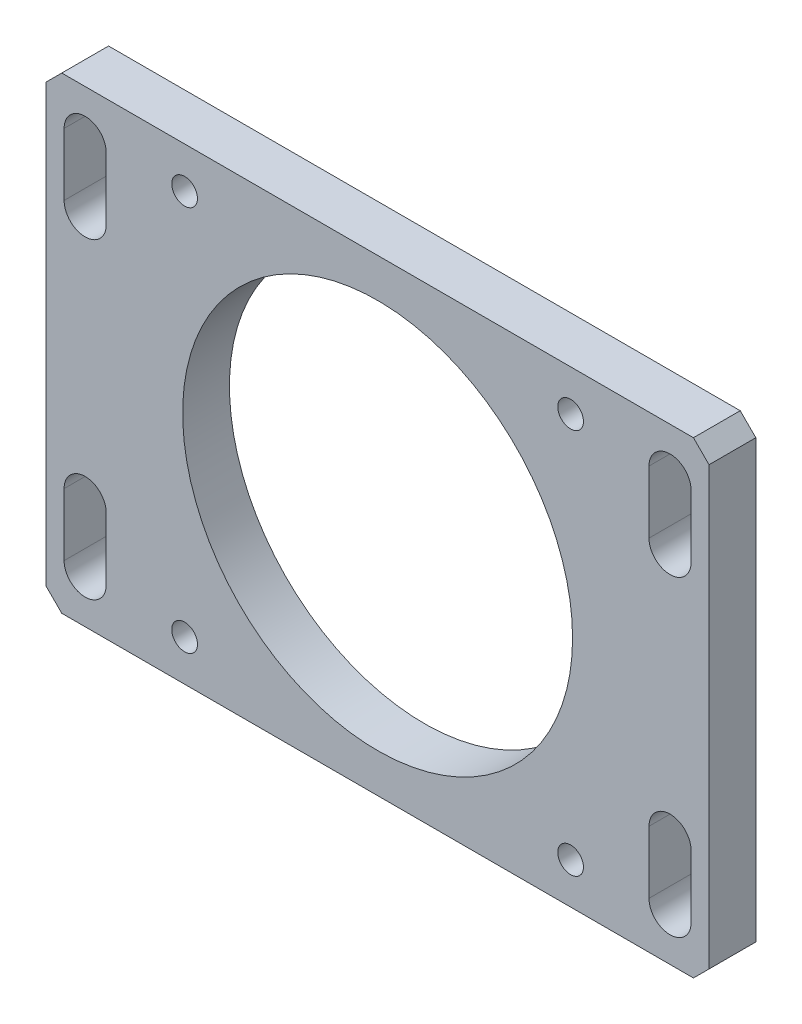
ISO-10303-21;
HEADER;
FILE_DESCRIPTION(('STEP AP214'),'2;1');
FILE_NAME('part.step','',(''),(''),'','','');
FILE_SCHEMA(('AUTOMOTIVE_DESIGN { 1 0 10303 214 1 1 1 1 }'));
ENDSEC;
DATA;
#1=APPLICATION_CONTEXT('core data for automotive mechanical design processes');
#2=APPLICATION_PROTOCOL_DEFINITION('international standard','automotive_design',2000,#1);
#3=PRODUCT_CONTEXT('',#1,'mechanical');
#4=PRODUCT('Part','Part','',(#3));
#5=PRODUCT_RELATED_PRODUCT_CATEGORY('part','',(#4));
#6=PRODUCT_DEFINITION_FORMATION('','',#4);
#7=PRODUCT_DEFINITION_CONTEXT('part definition',#1,'design');
#8=PRODUCT_DEFINITION('design','',#6,#7);
#9=PRODUCT_DEFINITION_SHAPE('','',#8);
#10=(LENGTH_UNIT() NAMED_UNIT(*) SI_UNIT(.MILLI.,.METRE.));
#11=(NAMED_UNIT(*) PLANE_ANGLE_UNIT() SI_UNIT($,.RADIAN.));
#12=(NAMED_UNIT(*) SI_UNIT($,.STERADIAN.) SOLID_ANGLE_UNIT());
#13=UNCERTAINTY_MEASURE_WITH_UNIT(LENGTH_MEASURE(1.E-05),#10,'distance_accuracy_value','');
#14=(GEOMETRIC_REPRESENTATION_CONTEXT(3) GLOBAL_UNCERTAINTY_ASSIGNED_CONTEXT((#13)) GLOBAL_UNIT_ASSIGNED_CONTEXT((#10,
#11,#12)) REPRESENTATION_CONTEXT('',''));
#15=CARTESIAN_POINT('',(0.,0.,0.));
#16=DIRECTION('',(0.,0.,1.));
#17=DIRECTION('',(1.,0.,0.));
#18=AXIS2_PLACEMENT_3D('',#15,#16,#17);
#19=CARTESIAN_POINT('',(0.,0.,6.));
#20=DIRECTION('',(0.,0.,-1.));
#21=DIRECTION('',(-1.,0.,0.));
#22=AXIS2_PLACEMENT_3D('',#19,#20,#21);
#23=PLANE('',#22);
#24=DIRECTION('',(0.,1.,0.));
#25=VECTOR('',#24,1.);
#26=CARTESIAN_POINT('',(-34.8,-24.,6.));
#27=LINE('',#26,#25);
#28=CARTESIAN_POINT('',(-34.8,-24.,6.));
#29=VERTEX_POINT('',#28);
#30=CARTESIAN_POINT('',(-34.8,-16.,6.));
#31=VERTEX_POINT('',#30);
#32=EDGE_CURVE('E233',#29,#31,#27,.T.);
#33=ORIENTED_EDGE('',*,*,#32,.F.);
#34=CARTESIAN_POINT('',(-37.5,-24.,6.));
#35=DIRECTION('',(0.,0.,1.));
#36=DIRECTION('',(1.,0.,0.));
#37=AXIS2_PLACEMENT_3D('',#34,#35,#36);
#38=CIRCLE('',#37,2.70000000000001);
#39=CARTESIAN_POINT('',(-40.2,-24.,6.));
#40=VERTEX_POINT('',#39);
#41=EDGE_CURVE('E206',#40,#29,#38,.T.);
#42=ORIENTED_EDGE('',*,*,#41,.F.);
#43=DIRECTION('',(0.,-1.,0.));
#44=VECTOR('',#43,1.);
#45=CARTESIAN_POINT('',(-40.2,-24.,6.));
#46=LINE('',#45,#44);
#47=CARTESIAN_POINT('',(-40.2,-16.,6.));
#48=VERTEX_POINT('',#47);
#49=EDGE_CURVE('E224',#48,#40,#46,.T.);
#50=ORIENTED_EDGE('',*,*,#49,.F.);
#51=CARTESIAN_POINT('',(-37.5,-16.,6.));
#52=DIRECTION('',(0.,0.,1.));
#53=DIRECTION('',(1.,0.,0.));
#54=AXIS2_PLACEMENT_3D('',#51,#52,#53);
#55=CIRCLE('',#54,2.70000000000001);
#56=EDGE_CURVE('E227',#31,#48,#55,.T.);
#57=ORIENTED_EDGE('',*,*,#56,.F.);
#58=EDGE_LOOP('',(#33,#42,#50,#57));
#59=FACE_BOUND('',#58,.T.);
#60=DIRECTION('',(0.,-1.,0.));
#61=VECTOR('',#60,1.);
#62=CARTESIAN_POINT('',(-40.2,24.,6.));
#63=LINE('',#62,#61);
#64=CARTESIAN_POINT('',(-40.2,24.,6.));
#65=VERTEX_POINT('',#64);
#66=CARTESIAN_POINT('',(-40.2,16.,6.));
#67=VERTEX_POINT('',#66);
#68=EDGE_CURVE('E258',#65,#67,#63,.T.);
#69=ORIENTED_EDGE('',*,*,#68,.F.);
#70=CARTESIAN_POINT('',(-37.5,24.,6.));
#71=DIRECTION('',(0.,0.,1.));
#72=DIRECTION('',(-1.,0.,0.));
#73=AXIS2_PLACEMENT_3D('',#70,#71,#72);
#74=CIRCLE('',#73,2.70000000000001);
#75=CARTESIAN_POINT('',(-34.8,24.,6.));
#76=VERTEX_POINT('',#75);
#77=EDGE_CURVE('E239',#76,#65,#74,.T.);
#78=ORIENTED_EDGE('',*,*,#77,.F.);
#79=DIRECTION('',(0.,1.,0.));
#80=VECTOR('',#79,1.);
#81=CARTESIAN_POINT('',(-34.8,24.,6.));
#82=LINE('',#81,#80);
#83=CARTESIAN_POINT('',(-34.8,16.,6.));
#84=VERTEX_POINT('',#83);
#85=EDGE_CURVE('E247',#84,#76,#82,.T.);
#86=ORIENTED_EDGE('',*,*,#85,.F.);
#87=CARTESIAN_POINT('',(-37.5,16.,6.));
#88=DIRECTION('',(0.,0.,1.));
#89=DIRECTION('',(-1.,0.,0.));
#90=AXIS2_PLACEMENT_3D('',#87,#88,#89);
#91=CIRCLE('',#90,2.70000000000001);
#92=EDGE_CURVE('E261',#67,#84,#91,.T.);
#93=ORIENTED_EDGE('',*,*,#92,.F.);
#94=EDGE_LOOP('',(#69,#78,#86,#93));
#95=FACE_BOUND('',#94,.T.);
#96=DIRECTION('',(0.,1.,0.));
#97=VECTOR('',#96,1.);
#98=CARTESIAN_POINT('',(40.2,-24.,6.));
#99=LINE('',#98,#97);
#100=CARTESIAN_POINT('',(40.2,-24.,6.));
#101=VERTEX_POINT('',#100);
#102=CARTESIAN_POINT('',(40.2,-16.,6.));
#103=VERTEX_POINT('',#102);
#104=EDGE_CURVE('E290',#101,#103,#99,.T.);
#105=ORIENTED_EDGE('',*,*,#104,.F.);
#106=CARTESIAN_POINT('',(37.5,-24.,6.));
#107=DIRECTION('',(0.,0.,1.));
#108=DIRECTION('',(-1.,0.,0.));
#109=AXIS2_PLACEMENT_3D('',#106,#107,#108);
#110=CIRCLE('',#109,2.70000000000001);
#111=CARTESIAN_POINT('',(34.8,-24.,6.));
#112=VERTEX_POINT('',#111);
#113=EDGE_CURVE('E268',#112,#101,#110,.T.);
#114=ORIENTED_EDGE('',*,*,#113,.F.);
#115=DIRECTION('',(0.,-1.,0.));
#116=VECTOR('',#115,1.);
#117=CARTESIAN_POINT('',(34.8,-24.,6.));
#118=LINE('',#117,#116);
#119=CARTESIAN_POINT('',(34.8,-16.,6.));
#120=VERTEX_POINT('',#119);
#121=EDGE_CURVE('E279',#120,#112,#118,.T.);
#122=ORIENTED_EDGE('',*,*,#121,.F.);
#123=CARTESIAN_POINT('',(37.5,-16.,6.));
#124=DIRECTION('',(0.,0.,1.));
#125=DIRECTION('',(-1.,0.,0.));
#126=AXIS2_PLACEMENT_3D('',#123,#124,#125);
#127=CIRCLE('',#126,2.70000000000001);
#128=EDGE_CURVE('E293',#103,#120,#127,.T.);
#129=ORIENTED_EDGE('',*,*,#128,.F.);
#130=EDGE_LOOP('',(#105,#114,#122,#129));
#131=FACE_BOUND('',#130,.T.);
#132=DIRECTION('',(0.,-1.,0.));
#133=VECTOR('',#132,1.);
#134=CARTESIAN_POINT('',(34.8,24.,6.));
#135=LINE('',#134,#133);
#136=CARTESIAN_POINT('',(34.8,24.,6.));
#137=VERTEX_POINT('',#136);
#138=CARTESIAN_POINT('',(34.8,16.,6.));
#139=VERTEX_POINT('',#138);
#140=EDGE_CURVE('E322',#137,#139,#135,.T.);
#141=ORIENTED_EDGE('',*,*,#140,.F.);
#142=CARTESIAN_POINT('',(37.5,24.,6.));
#143=DIRECTION('',(0.,0.,1.));
#144=DIRECTION('',(1.,0.,0.));
#145=AXIS2_PLACEMENT_3D('',#142,#143,#144);
#146=CIRCLE('',#145,2.70000000000001);
#147=CARTESIAN_POINT('',(40.2,24.,6.));
#148=VERTEX_POINT('',#147);
#149=EDGE_CURVE('E300',#148,#137,#146,.T.);
#150=ORIENTED_EDGE('',*,*,#149,.F.);
#151=DIRECTION('',(0.,1.,0.));
#152=VECTOR('',#151,1.);
#153=CARTESIAN_POINT('',(40.2,24.,6.));
#154=LINE('',#153,#152);
#155=CARTESIAN_POINT('',(40.2,16.,6.));
#156=VERTEX_POINT('',#155);
#157=EDGE_CURVE('E311',#156,#148,#154,.T.);
#158=ORIENTED_EDGE('',*,*,#157,.F.);
#159=CARTESIAN_POINT('',(37.5,16.,6.));
#160=DIRECTION('',(0.,0.,1.));
#161=DIRECTION('',(1.,0.,0.));
#162=AXIS2_PLACEMENT_3D('',#159,#160,#161);
#163=CIRCLE('',#162,2.70000000000001);
#164=EDGE_CURVE('E325',#139,#156,#163,.T.);
#165=ORIENTED_EDGE('',*,*,#164,.F.);
#166=EDGE_LOOP('',(#141,#150,#158,#165));
#167=FACE_BOUND('',#166,.T.);
#168=CARTESIAN_POINT('',(-24.7487373415288,24.7487373415296,6.));
#169=DIRECTION('',(0.,0.,1.));
#170=DIRECTION('',(1.,0.,0.));
#171=AXIS2_PLACEMENT_3D('',#168,#169,#170);
#172=CIRCLE('',#171,1.65);
#173=CARTESIAN_POINT('',(-23.0987373415288,24.7487373415296,6.));
#174=VERTEX_POINT('',#173);
#175=EDGE_CURVE('E332',#174,#174,#172,.T.);
#176=ORIENTED_EDGE('',*,*,#175,.F.);
#177=EDGE_LOOP('',(#176));
#178=FACE_BOUND('',#177,.T.);
#179=CARTESIAN_POINT('',(-24.7487373415293,-24.748737341529,6.));
#180=DIRECTION('',(0.,0.,1.));
#181=DIRECTION('',(1.,0.,0.));
#182=AXIS2_PLACEMENT_3D('',#179,#180,#181);
#183=CIRCLE('',#182,1.65);
#184=CARTESIAN_POINT('',(-23.0987373415293,-24.748737341529,6.));
#185=VERTEX_POINT('',#184);
#186=EDGE_CURVE('E342',#185,#185,#183,.T.);
#187=ORIENTED_EDGE('',*,*,#186,.F.);
#188=EDGE_LOOP('',(#187));
#189=FACE_BOUND('',#188,.T.);
#190=CARTESIAN_POINT('',(24.7487373415289,-24.7487373415294,6.));
#191=DIRECTION('',(0.,0.,1.));
#192=DIRECTION('',(1.,0.,0.));
#193=AXIS2_PLACEMENT_3D('',#190,#191,#192);
#194=CIRCLE('',#193,1.65);
#195=CARTESIAN_POINT('',(26.3987373415289,-24.7487373415294,6.));
#196=VERTEX_POINT('',#195);
#197=EDGE_CURVE('E346',#196,#196,#194,.T.);
#198=ORIENTED_EDGE('',*,*,#197,.F.);
#199=EDGE_LOOP('',(#198));
#200=FACE_BOUND('',#199,.T.);
#201=CARTESIAN_POINT('',(24.7487373415293,24.748737341529,6.));
#202=DIRECTION('',(0.,0.,1.));
#203=DIRECTION('',(1.,0.,0.));
#204=AXIS2_PLACEMENT_3D('',#201,#202,#203);
#205=CIRCLE('',#204,1.65);
#206=CARTESIAN_POINT('',(26.3987373415293,24.748737341529,6.));
#207=VERTEX_POINT('',#206);
#208=EDGE_CURVE('E350',#207,#207,#205,.T.);
#209=ORIENTED_EDGE('',*,*,#208,.F.);
#210=EDGE_LOOP('',(#209));
#211=FACE_BOUND('',#210,.T.);
#212=DIRECTION('',(0.,-1.,0.));
#213=VECTOR('',#212,1.);
#214=CARTESIAN_POINT('',(-42.5,-30.,6.));
#215=LINE('',#214,#213);
#216=CARTESIAN_POINT('',(-42.5,28.,6.));
#217=VERTEX_POINT('',#216);
#218=CARTESIAN_POINT('',(-42.5,-28.,6.));
#219=VERTEX_POINT('',#218);
#220=EDGE_CURVE('E366',#217,#219,#215,.T.);
#221=ORIENTED_EDGE('',*,*,#220,.T.);
#222=DIRECTION('',(-0.707106781186545,0.70710678118655,0.));
#223=VECTOR('',#222,1.);
#224=CARTESIAN_POINT('',(-40.5,-30.,6.));
#225=LINE('',#224,#223);
#226=CARTESIAN_POINT('',(-40.5,-30.,6.));
#227=VERTEX_POINT('',#226);
#228=EDGE_CURVE('E412',#219,#227,#225,.F.);
#229=ORIENTED_EDGE('',*,*,#228,.T.);
#230=DIRECTION('',(1.,0.,0.));
#231=VECTOR('',#230,1.);
#232=CARTESIAN_POINT('',(-42.5,-30.,6.));
#233=LINE('',#232,#231);
#234=CARTESIAN_POINT('',(40.5,-30.,6.));
#235=VERTEX_POINT('',#234);
#236=EDGE_CURVE('E369',#227,#235,#233,.T.);
#237=ORIENTED_EDGE('',*,*,#236,.T.);
#238=DIRECTION('',(-0.70710678118655,-0.707106781186545,0.));
#239=VECTOR('',#238,1.);
#240=CARTESIAN_POINT('',(42.5,-28.,6.));
#241=LINE('',#240,#239);
#242=CARTESIAN_POINT('',(42.5,-28.,6.));
#243=VERTEX_POINT('',#242);
#244=EDGE_CURVE('E408',#235,#243,#241,.F.);
#245=ORIENTED_EDGE('',*,*,#244,.T.);
#246=DIRECTION('',(0.,1.,0.));
#247=VECTOR('',#246,1.);
#248=CARTESIAN_POINT('',(42.5,-30.,6.));
#249=LINE('',#248,#247);
#250=CARTESIAN_POINT('',(42.5,28.,6.));
#251=VERTEX_POINT('',#250);
#252=EDGE_CURVE('E361',#243,#251,#249,.T.);
#253=ORIENTED_EDGE('',*,*,#252,.T.);
#254=DIRECTION('',(0.707106781186545,-0.70710678118655,0.));
#255=VECTOR('',#254,1.);
#256=CARTESIAN_POINT('',(40.5,30.,6.));
#257=LINE('',#256,#255);
#258=CARTESIAN_POINT('',(40.5,30.,6.));
#259=VERTEX_POINT('',#258);
#260=EDGE_CURVE('E58',#251,#259,#257,.F.);
#261=ORIENTED_EDGE('',*,*,#260,.T.);
#262=DIRECTION('',(-1.,0.,0.));
#263=VECTOR('',#262,1.);
#264=CARTESIAN_POINT('',(-42.5,30.,6.));
#265=LINE('',#264,#263);
#266=CARTESIAN_POINT('',(-40.5,30.,6.));
#267=VERTEX_POINT('',#266);
#268=EDGE_CURVE('E363',#259,#267,#265,.T.);
#269=ORIENTED_EDGE('',*,*,#268,.T.);
#270=DIRECTION('',(0.70710678118655,0.707106781186545,0.));
#271=VECTOR('',#270,1.);
#272=CARTESIAN_POINT('',(-42.5,28.,6.));
#273=LINE('',#272,#271);
#274=EDGE_CURVE('E410',#267,#217,#273,.F.);
#275=ORIENTED_EDGE('',*,*,#274,.T.);
#276=EDGE_LOOP('',(#221,#229,#237,#245,#253,#261,#269,#275));
#277=FACE_BOUND('',#276,.T.);
#278=CARTESIAN_POINT('',(0.,0.,6.));
#279=DIRECTION('',(0.,0.,1.));
#280=DIRECTION('',(1.,0.,0.));
#281=AXIS2_PLACEMENT_3D('',#278,#279,#280);
#282=CIRCLE('',#281,25.);
#283=CARTESIAN_POINT('',(25.,0.,6.));
#284=VERTEX_POINT('',#283);
#285=EDGE_CURVE('E354',#284,#284,#282,.T.);
#286=ORIENTED_EDGE('',*,*,#285,.F.);
#287=EDGE_LOOP('',(#286));
#288=FACE_BOUND('',#287,.T.);
#289=ADVANCED_FACE('F36',(#59,#95,#131,#167,#178,#189,#200,#211,#277,#288),#23,.F.);
#290=CARTESIAN_POINT('',(0.,0.,0.));
#291=DIRECTION('',(0.,0.,-1.));
#292=DIRECTION('',(-1.,0.,0.));
#293=AXIS2_PLACEMENT_3D('',#290,#291,#292);
#294=PLANE('',#293);
#295=CARTESIAN_POINT('',(-37.5,-24.,0.));
#296=DIRECTION('',(0.,0.,1.));
#297=DIRECTION('',(1.,0.,0.));
#298=AXIS2_PLACEMENT_3D('',#295,#296,#297);
#299=CIRCLE('',#298,2.70000000000001);
#300=CARTESIAN_POINT('',(-40.2,-24.,0.));
#301=VERTEX_POINT('',#300);
#302=CARTESIAN_POINT('',(-34.8,-24.,0.));
#303=VERTEX_POINT('',#302);
#304=EDGE_CURVE('E203',#301,#303,#299,.T.);
#305=ORIENTED_EDGE('',*,*,#304,.T.);
#306=DIRECTION('',(0.,1.,0.));
#307=VECTOR('',#306,1.);
#308=CARTESIAN_POINT('',(-34.8,-24.,0.));
#309=LINE('',#308,#307);
#310=CARTESIAN_POINT('',(-34.8,-16.,0.));
#311=VERTEX_POINT('',#310);
#312=EDGE_CURVE('E215',#303,#311,#309,.T.);
#313=ORIENTED_EDGE('',*,*,#312,.T.);
#314=CARTESIAN_POINT('',(-37.5,-16.,0.));
#315=DIRECTION('',(0.,0.,1.));
#316=DIRECTION('',(1.,0.,0.));
#317=AXIS2_PLACEMENT_3D('',#314,#315,#316);
#318=CIRCLE('',#317,2.70000000000001);
#319=CARTESIAN_POINT('',(-40.2,-16.,0.));
#320=VERTEX_POINT('',#319);
#321=EDGE_CURVE('E219',#311,#320,#318,.T.);
#322=ORIENTED_EDGE('',*,*,#321,.T.);
#323=DIRECTION('',(0.,-1.,0.));
#324=VECTOR('',#323,1.);
#325=CARTESIAN_POINT('',(-40.2,-24.,0.));
#326=LINE('',#325,#324);
#327=EDGE_CURVE('E211',#320,#301,#326,.T.);
#328=ORIENTED_EDGE('',*,*,#327,.T.);
#329=EDGE_LOOP('',(#305,#313,#322,#328));
#330=FACE_BOUND('',#329,.T.);
#331=CARTESIAN_POINT('',(-37.5,24.,0.));
#332=DIRECTION('',(0.,0.,1.));
#333=DIRECTION('',(-1.,0.,0.));
#334=AXIS2_PLACEMENT_3D('',#331,#332,#333);
#335=CIRCLE('',#334,2.70000000000001);
#336=CARTESIAN_POINT('',(-34.8,24.,0.));
#337=VERTEX_POINT('',#336);
#338=CARTESIAN_POINT('',(-40.2,24.,0.));
#339=VERTEX_POINT('',#338);
#340=EDGE_CURVE('E243',#337,#339,#335,.T.);
#341=ORIENTED_EDGE('',*,*,#340,.T.);
#342=DIRECTION('',(0.,-1.,0.));
#343=VECTOR('',#342,1.);
#344=CARTESIAN_POINT('',(-40.2,24.,0.));
#345=LINE('',#344,#343);
#346=CARTESIAN_POINT('',(-40.2,16.,0.));
#347=VERTEX_POINT('',#346);
#348=EDGE_CURVE('E246',#339,#347,#345,.T.);
#349=ORIENTED_EDGE('',*,*,#348,.T.);
#350=CARTESIAN_POINT('',(-37.5,16.,0.));
#351=DIRECTION('',(0.,0.,1.));
#352=DIRECTION('',(-1.,0.,0.));
#353=AXIS2_PLACEMENT_3D('',#350,#351,#352);
#354=CIRCLE('',#353,2.70000000000001);
#355=CARTESIAN_POINT('',(-34.8,16.,0.));
#356=VERTEX_POINT('',#355);
#357=EDGE_CURVE('E250',#347,#356,#354,.T.);
#358=ORIENTED_EDGE('',*,*,#357,.T.);
#359=DIRECTION('',(0.,1.,0.));
#360=VECTOR('',#359,1.);
#361=CARTESIAN_POINT('',(-34.8,24.,0.));
#362=LINE('',#361,#360);
#363=EDGE_CURVE('E253',#356,#337,#362,.T.);
#364=ORIENTED_EDGE('',*,*,#363,.T.);
#365=EDGE_LOOP('',(#341,#349,#358,#364));
#366=FACE_BOUND('',#365,.T.);
#367=CARTESIAN_POINT('',(37.5,-24.,0.));
#368=DIRECTION('',(0.,0.,1.));
#369=DIRECTION('',(-1.,0.,0.));
#370=AXIS2_PLACEMENT_3D('',#367,#368,#369);
#371=CIRCLE('',#370,2.70000000000001);
#372=CARTESIAN_POINT('',(34.8,-24.,0.));
#373=VERTEX_POINT('',#372);
#374=CARTESIAN_POINT('',(40.2,-24.,0.));
#375=VERTEX_POINT('',#374);
#376=EDGE_CURVE('E275',#373,#375,#371,.T.);
#377=ORIENTED_EDGE('',*,*,#376,.T.);
#378=DIRECTION('',(0.,1.,0.));
#379=VECTOR('',#378,1.);
#380=CARTESIAN_POINT('',(40.2,-24.,0.));
#381=LINE('',#380,#379);
#382=CARTESIAN_POINT('',(40.2,-16.,0.));
#383=VERTEX_POINT('',#382);
#384=EDGE_CURVE('E278',#375,#383,#381,.T.);
#385=ORIENTED_EDGE('',*,*,#384,.T.);
#386=CARTESIAN_POINT('',(37.5,-16.,0.));
#387=DIRECTION('',(0.,0.,1.));
#388=DIRECTION('',(-1.,0.,0.));
#389=AXIS2_PLACEMENT_3D('',#386,#387,#388);
#390=CIRCLE('',#389,2.70000000000001);
#391=CARTESIAN_POINT('',(34.8,-16.,0.));
#392=VERTEX_POINT('',#391);
#393=EDGE_CURVE('E282',#383,#392,#390,.T.);
#394=ORIENTED_EDGE('',*,*,#393,.T.);
#395=DIRECTION('',(0.,-1.,0.));
#396=VECTOR('',#395,1.);
#397=CARTESIAN_POINT('',(34.8,-24.,0.));
#398=LINE('',#397,#396);
#399=EDGE_CURVE('E285',#392,#373,#398,.T.);
#400=ORIENTED_EDGE('',*,*,#399,.T.);
#401=EDGE_LOOP('',(#377,#385,#394,#400));
#402=FACE_BOUND('',#401,.T.);
#403=CARTESIAN_POINT('',(37.5,24.,0.));
#404=DIRECTION('',(0.,0.,1.));
#405=DIRECTION('',(1.,0.,0.));
#406=AXIS2_PLACEMENT_3D('',#403,#404,#405);
#407=CIRCLE('',#406,2.70000000000001);
#408=CARTESIAN_POINT('',(40.2,24.,0.));
#409=VERTEX_POINT('',#408);
#410=CARTESIAN_POINT('',(34.8,24.,0.));
#411=VERTEX_POINT('',#410);
#412=EDGE_CURVE('E307',#409,#411,#407,.T.);
#413=ORIENTED_EDGE('',*,*,#412,.T.);
#414=DIRECTION('',(0.,-1.,0.));
#415=VECTOR('',#414,1.);
#416=CARTESIAN_POINT('',(34.8,24.,0.));
#417=LINE('',#416,#415);
#418=CARTESIAN_POINT('',(34.8,16.,0.));
#419=VERTEX_POINT('',#418);
#420=EDGE_CURVE('E310',#411,#419,#417,.T.);
#421=ORIENTED_EDGE('',*,*,#420,.T.);
#422=CARTESIAN_POINT('',(37.5,16.,0.));
#423=DIRECTION('',(0.,0.,1.));
#424=DIRECTION('',(1.,0.,0.));
#425=AXIS2_PLACEMENT_3D('',#422,#423,#424);
#426=CIRCLE('',#425,2.70000000000001);
#427=CARTESIAN_POINT('',(40.2,16.,0.));
#428=VERTEX_POINT('',#427);
#429=EDGE_CURVE('E314',#419,#428,#426,.T.);
#430=ORIENTED_EDGE('',*,*,#429,.T.);
#431=DIRECTION('',(0.,1.,0.));
#432=VECTOR('',#431,1.);
#433=CARTESIAN_POINT('',(40.2,24.,0.));
#434=LINE('',#433,#432);
#435=EDGE_CURVE('E317',#428,#409,#434,.T.);
#436=ORIENTED_EDGE('',*,*,#435,.T.);
#437=EDGE_LOOP('',(#413,#421,#430,#436));
#438=FACE_BOUND('',#437,.T.);
#439=CARTESIAN_POINT('',(-24.7487373415288,24.7487373415296,0.));
#440=DIRECTION('',(0.,0.,-1.));
#441=DIRECTION('',(-1.,0.,0.));
#442=AXIS2_PLACEMENT_3D('',#439,#440,#441);
#443=CIRCLE('',#442,1.65);
#444=CARTESIAN_POINT('',(-26.3987373415288,24.7487373415296,0.));
#445=VERTEX_POINT('',#444);
#446=EDGE_CURVE('E341',#445,#445,#443,.T.);
#447=ORIENTED_EDGE('',*,*,#446,.F.);
#448=EDGE_LOOP('',(#447));
#449=FACE_BOUND('',#448,.T.);
#450=CARTESIAN_POINT('',(-24.7487373415293,-24.748737341529,0.));
#451=DIRECTION('',(0.,0.,-1.));
#452=DIRECTION('',(-1.,0.,0.));
#453=AXIS2_PLACEMENT_3D('',#450,#451,#452);
#454=CIRCLE('',#453,1.65);
#455=CARTESIAN_POINT('',(-26.3987373415293,-24.748737341529,0.));
#456=VERTEX_POINT('',#455);
#457=EDGE_CURVE('E345',#456,#456,#454,.T.);
#458=ORIENTED_EDGE('',*,*,#457,.F.);
#459=EDGE_LOOP('',(#458));
#460=FACE_BOUND('',#459,.T.);
#461=CARTESIAN_POINT('',(24.7487373415289,-24.7487373415294,0.));
#462=DIRECTION('',(0.,0.,-1.));
#463=DIRECTION('',(-1.,0.,0.));
#464=AXIS2_PLACEMENT_3D('',#461,#462,#463);
#465=CIRCLE('',#464,1.65);
#466=CARTESIAN_POINT('',(23.098737341529,-24.7487373415294,0.));
#467=VERTEX_POINT('',#466);
#468=EDGE_CURVE('E349',#467,#467,#465,.T.);
#469=ORIENTED_EDGE('',*,*,#468,.F.);
#470=EDGE_LOOP('',(#469));
#471=FACE_BOUND('',#470,.T.);
#472=CARTESIAN_POINT('',(24.7487373415293,24.748737341529,0.));
#473=DIRECTION('',(0.,0.,-1.));
#474=DIRECTION('',(-1.,0.,0.));
#475=AXIS2_PLACEMENT_3D('',#472,#473,#474);
#476=CIRCLE('',#475,1.65);
#477=CARTESIAN_POINT('',(23.0987373415293,24.748737341529,0.));
#478=VERTEX_POINT('',#477);
#479=EDGE_CURVE('E353',#478,#478,#476,.T.);
#480=ORIENTED_EDGE('',*,*,#479,.F.);
#481=EDGE_LOOP('',(#480));
#482=FACE_BOUND('',#481,.T.);
#483=DIRECTION('',(1.,0.,0.));
#484=VECTOR('',#483,1.);
#485=CARTESIAN_POINT('',(-42.5,-30.,0.));
#486=LINE('',#485,#484);
#487=CARTESIAN_POINT('',(-40.5,-30.,0.));
#488=VERTEX_POINT('',#487);
#489=CARTESIAN_POINT('',(40.5,-30.,0.));
#490=VERTEX_POINT('',#489);
#491=EDGE_CURVE('E364',#488,#490,#486,.T.);
#492=ORIENTED_EDGE('',*,*,#491,.F.);
#493=DIRECTION('',(0.707106781186545,-0.70710678118655,0.));
#494=VECTOR('',#493,1.);
#495=CARTESIAN_POINT('',(-35.2500000000001,-35.2499999999999,0.));
#496=LINE('',#495,#494);
#497=CARTESIAN_POINT('',(-42.5,-28.,0.));
#498=VERTEX_POINT('',#497);
#499=EDGE_CURVE('E400',#488,#498,#496,.F.);
#500=ORIENTED_EDGE('',*,*,#499,.T.);
#501=DIRECTION('',(0.,-1.,0.));
#502=VECTOR('',#501,1.);
#503=CARTESIAN_POINT('',(-42.5,-30.,0.));
#504=LINE('',#503,#502);
#505=CARTESIAN_POINT('',(-42.5,28.,0.));
#506=VERTEX_POINT('',#505);
#507=EDGE_CURVE('E377',#506,#498,#504,.T.);
#508=ORIENTED_EDGE('',*,*,#507,.F.);
#509=DIRECTION('',(-0.70710678118655,-0.707106781186545,0.));
#510=VECTOR('',#509,1.);
#511=CARTESIAN_POINT('',(-35.2499999999999,35.2500000000001,0.));
#512=LINE('',#511,#510);
#513=CARTESIAN_POINT('',(-40.5,30.,0.));
#514=VERTEX_POINT('',#513);
#515=EDGE_CURVE('E398',#506,#514,#512,.F.);
#516=ORIENTED_EDGE('',*,*,#515,.T.);
#517=DIRECTION('',(-1.,0.,0.));
#518=VECTOR('',#517,1.);
#519=CARTESIAN_POINT('',(-42.5,30.,0.));
#520=LINE('',#519,#518);
#521=CARTESIAN_POINT('',(40.5,30.,0.));
#522=VERTEX_POINT('',#521);
#523=EDGE_CURVE('E375',#522,#514,#520,.T.);
#524=ORIENTED_EDGE('',*,*,#523,.F.);
#525=DIRECTION('',(-0.707106781186545,0.70710678118655,0.));
#526=VECTOR('',#525,1.);
#527=CARTESIAN_POINT('',(35.2500000000001,35.2499999999999,0.));
#528=LINE('',#527,#526);
#529=CARTESIAN_POINT('',(42.5,28.,0.));
#530=VERTEX_POINT('',#529);
#531=EDGE_CURVE('E394',#522,#530,#528,.F.);
#532=ORIENTED_EDGE('',*,*,#531,.T.);
#533=DIRECTION('',(0.,1.,0.));
#534=VECTOR('',#533,1.);
#535=CARTESIAN_POINT('',(42.5,-30.,0.));
#536=LINE('',#535,#534);
#537=CARTESIAN_POINT('',(42.5,-28.,0.));
#538=VERTEX_POINT('',#537);
#539=EDGE_CURVE('E357',#538,#530,#536,.T.);
#540=ORIENTED_EDGE('',*,*,#539,.F.);
#541=DIRECTION('',(0.70710678118655,0.707106781186545,0.));
#542=VECTOR('',#541,1.);
#543=CARTESIAN_POINT('',(35.2499999999999,-35.2500000000001,0.));
#544=LINE('',#543,#542);
#545=EDGE_CURVE('E396',#538,#490,#544,.F.);
#546=ORIENTED_EDGE('',*,*,#545,.T.);
#547=EDGE_LOOP('',(#492,#500,#508,#516,#524,#532,#540,#546));
#548=FACE_BOUND('',#547,.T.);
#549=CARTESIAN_POINT('',(0.,0.,0.));
#550=DIRECTION('',(0.,0.,1.));
#551=DIRECTION('',(1.,0.,0.));
#552=AXIS2_PLACEMENT_3D('',#549,#550,#551);
#553=CIRCLE('',#552,25.);
#554=CARTESIAN_POINT('',(25.,0.,0.));
#555=VERTEX_POINT('',#554);
#556=EDGE_CURVE('E358',#555,#555,#553,.T.);
#557=ORIENTED_EDGE('',*,*,#556,.T.);
#558=EDGE_LOOP('',(#557));
#559=FACE_BOUND('',#558,.T.);
#560=ADVANCED_FACE('F221',(#330,#366,#402,#438,#449,#460,#471,#482,#548,#559),#294,.T.);
#561=CARTESIAN_POINT('',(42.5,-30.,6.));
#562=DIRECTION('',(-1.,0.,0.));
#563=DIRECTION('',(0.,0.,1.));
#564=AXIS2_PLACEMENT_3D('',#561,#562,#563);
#565=PLANE('',#564);
#566=ORIENTED_EDGE('',*,*,#252,.F.);
#567=DIRECTION('',(0.,0.,-1.));
#568=VECTOR('',#567,1.);
#569=CARTESIAN_POINT('',(42.5,-28.,6.));
#570=LINE('',#569,#568);
#571=EDGE_CURVE('E11',#243,#538,#570,.T.);
#572=ORIENTED_EDGE('',*,*,#571,.T.);
#573=ORIENTED_EDGE('',*,*,#539,.T.);
#574=DIRECTION('',(0.,0.,1.));
#575=VECTOR('',#574,1.);
#576=CARTESIAN_POINT('',(42.5,28.,6.));
#577=LINE('',#576,#575);
#578=EDGE_CURVE('E44',#530,#251,#577,.T.);
#579=ORIENTED_EDGE('',*,*,#578,.T.);
#580=EDGE_LOOP('',(#566,#572,#573,#579));
#581=FACE_BOUND('',#580,.T.);
#582=ADVANCED_FACE('F420',(#581),#565,.F.);
#583=CARTESIAN_POINT('',(-42.5,30.,6.));
#584=DIRECTION('',(0.,-1.,0.));
#585=DIRECTION('',(0.,0.,-1.));
#586=AXIS2_PLACEMENT_3D('',#583,#584,#585);
#587=PLANE('',#586);
#588=ORIENTED_EDGE('',*,*,#523,.T.);
#589=DIRECTION('',(0.,0.,1.));
#590=VECTOR('',#589,1.);
#591=CARTESIAN_POINT('',(-40.5,30.,6.));
#592=LINE('',#591,#590);
#593=EDGE_CURVE('E51',#514,#267,#592,.T.);
#594=ORIENTED_EDGE('',*,*,#593,.T.);
#595=ORIENTED_EDGE('',*,*,#268,.F.);
#596=DIRECTION('',(0.,0.,-1.));
#597=VECTOR('',#596,1.);
#598=CARTESIAN_POINT('',(40.5,30.,6.));
#599=LINE('',#598,#597);
#600=EDGE_CURVE('E414',#259,#522,#599,.T.);
#601=ORIENTED_EDGE('',*,*,#600,.T.);
#602=EDGE_LOOP('',(#588,#594,#595,#601));
#603=FACE_BOUND('',#602,.T.);
#604=ADVANCED_FACE('F428',(#603),#587,.F.);
#605=CARTESIAN_POINT('',(-42.5,-30.,6.));
#606=DIRECTION('',(1.,0.,0.));
#607=DIRECTION('',(0.,0.,-1.));
#608=AXIS2_PLACEMENT_3D('',#605,#606,#607);
#609=PLANE('',#608);
#610=ORIENTED_EDGE('',*,*,#507,.T.);
#611=DIRECTION('',(0.,0.,1.));
#612=VECTOR('',#611,1.);
#613=CARTESIAN_POINT('',(-42.5,-28.,6.));
#614=LINE('',#613,#612);
#615=EDGE_CURVE('E405',#498,#219,#614,.T.);
#616=ORIENTED_EDGE('',*,*,#615,.T.);
#617=ORIENTED_EDGE('',*,*,#220,.F.);
#618=DIRECTION('',(0.,0.,-1.));
#619=VECTOR('',#618,1.);
#620=CARTESIAN_POINT('',(-42.5,28.,6.));
#621=LINE('',#620,#619);
#622=EDGE_CURVE('E402',#217,#506,#621,.T.);
#623=ORIENTED_EDGE('',*,*,#622,.T.);
#624=EDGE_LOOP('',(#610,#616,#617,#623));
#625=FACE_BOUND('',#624,.T.);
#626=ADVANCED_FACE('F439',(#625),#609,.F.);
#627=CARTESIAN_POINT('',(-42.5,-30.,6.));
#628=DIRECTION('',(0.,1.,0.));
#629=DIRECTION('',(0.,0.,1.));
#630=AXIS2_PLACEMENT_3D('',#627,#628,#629);
#631=PLANE('',#630);
#632=ORIENTED_EDGE('',*,*,#236,.F.);
#633=DIRECTION('',(0.,0.,-1.));
#634=VECTOR('',#633,1.);
#635=CARTESIAN_POINT('',(-40.5,-30.,6.));
#636=LINE('',#635,#634);
#637=EDGE_CURVE('E391',#227,#488,#636,.T.);
#638=ORIENTED_EDGE('',*,*,#637,.T.);
#639=ORIENTED_EDGE('',*,*,#491,.T.);
#640=DIRECTION('',(0.,0.,1.));
#641=VECTOR('',#640,1.);
#642=CARTESIAN_POINT('',(40.5,-30.,6.));
#643=LINE('',#642,#641);
#644=EDGE_CURVE('E372',#490,#235,#643,.T.);
#645=ORIENTED_EDGE('',*,*,#644,.T.);
#646=EDGE_LOOP('',(#632,#638,#639,#645));
#647=FACE_BOUND('',#646,.T.);
#648=ADVANCED_FACE('F447',(#647),#631,.F.);
#649=CARTESIAN_POINT('',(0.,0.,6.));
#650=DIRECTION('',(0.,0.,-1.));
#651=DIRECTION('',(-1.,0.,0.));
#652=AXIS2_PLACEMENT_3D('',#649,#650,#651);
#653=CYLINDRICAL_SURFACE('',#652,25.);
#654=ORIENTED_EDGE('',*,*,#285,.T.);
#655=EDGE_LOOP('',(#654));
#656=FACE_BOUND('',#655,.T.);
#657=ORIENTED_EDGE('',*,*,#556,.F.);
#658=EDGE_LOOP('',(#657));
#659=FACE_BOUND('',#658,.T.);
#660=ADVANCED_FACE('F466',(#656,#659),#653,.F.);
#661=CARTESIAN_POINT('',(24.7487373415293,24.748737341529,6.));
#662=DIRECTION('',(0.,0.,1.));
#663=DIRECTION('',(1.,0.,0.));
#664=AXIS2_PLACEMENT_3D('',#661,#662,#663);
#665=CYLINDRICAL_SURFACE('',#664,1.65);
#666=ORIENTED_EDGE('',*,*,#479,.T.);
#667=EDGE_LOOP('',(#666));
#668=FACE_BOUND('',#667,.T.);
#669=ORIENTED_EDGE('',*,*,#208,.T.);
#670=EDGE_LOOP('',(#669));
#671=FACE_BOUND('',#670,.T.);
#672=ADVANCED_FACE('F551',(#668,#671),#665,.F.);
#673=CARTESIAN_POINT('',(24.7487373415289,-24.7487373415294,6.));
#674=DIRECTION('',(0.,0.,1.));
#675=DIRECTION('',(1.,0.,0.));
#676=AXIS2_PLACEMENT_3D('',#673,#674,#675);
#677=CYLINDRICAL_SURFACE('',#676,1.65);
#678=ORIENTED_EDGE('',*,*,#468,.T.);
#679=EDGE_LOOP('',(#678));
#680=FACE_BOUND('',#679,.T.);
#681=ORIENTED_EDGE('',*,*,#197,.T.);
#682=EDGE_LOOP('',(#681));
#683=FACE_BOUND('',#682,.T.);
#684=ADVANCED_FACE('F548',(#680,#683),#677,.F.);
#685=CARTESIAN_POINT('',(-24.7487373415293,-24.748737341529,6.));
#686=DIRECTION('',(0.,0.,1.));
#687=DIRECTION('',(1.,0.,0.));
#688=AXIS2_PLACEMENT_3D('',#685,#686,#687);
#689=CYLINDRICAL_SURFACE('',#688,1.65);
#690=ORIENTED_EDGE('',*,*,#457,.T.);
#691=EDGE_LOOP('',(#690));
#692=FACE_BOUND('',#691,.T.);
#693=ORIENTED_EDGE('',*,*,#186,.T.);
#694=EDGE_LOOP('',(#693));
#695=FACE_BOUND('',#694,.T.);
#696=ADVANCED_FACE('F544',(#692,#695),#689,.F.);
#697=CARTESIAN_POINT('',(-24.7487373415288,24.7487373415296,6.));
#698=DIRECTION('',(0.,0.,1.));
#699=DIRECTION('',(1.,0.,0.));
#700=AXIS2_PLACEMENT_3D('',#697,#698,#699);
#701=CYLINDRICAL_SURFACE('',#700,1.65);
#702=ORIENTED_EDGE('',*,*,#446,.T.);
#703=EDGE_LOOP('',(#702));
#704=FACE_BOUND('',#703,.T.);
#705=ORIENTED_EDGE('',*,*,#175,.T.);
#706=EDGE_LOOP('',(#705));
#707=FACE_BOUND('',#706,.T.);
#708=ADVANCED_FACE('F540',(#704,#707),#701,.F.);
#709=CARTESIAN_POINT('',(37.5,24.,0.));
#710=DIRECTION('',(0.,0.,1.));
#711=DIRECTION('',(1.,0.,0.));
#712=AXIS2_PLACEMENT_3D('',#709,#710,#711);
#713=CYLINDRICAL_SURFACE('',#712,2.70000000000001);
#714=ORIENTED_EDGE('',*,*,#149,.T.);
#715=DIRECTION('',(0.,0.,1.));
#716=VECTOR('',#715,1.);
#717=CARTESIAN_POINT('',(34.8,24.,0.));
#718=LINE('',#717,#716);
#719=EDGE_CURVE('E320',#411,#137,#718,.T.);
#720=ORIENTED_EDGE('',*,*,#719,.F.);
#721=ORIENTED_EDGE('',*,*,#412,.F.);
#722=DIRECTION('',(0.,0.,1.));
#723=VECTOR('',#722,1.);
#724=CARTESIAN_POINT('',(40.2,24.,0.));
#725=LINE('',#724,#723);
#726=EDGE_CURVE('E330',#409,#148,#725,.T.);
#727=ORIENTED_EDGE('',*,*,#726,.T.);
#728=EDGE_LOOP('',(#714,#720,#721,#727));
#729=FACE_BOUND('',#728,.T.);
#730=ADVANCED_FACE('F530',(#729),#713,.F.);
#731=CARTESIAN_POINT('',(40.2,24.,0.));
#732=DIRECTION('',(1.,0.,0.));
#733=DIRECTION('',(0.,0.,-1.));
#734=AXIS2_PLACEMENT_3D('',#731,#732,#733);
#735=PLANE('',#734);
#736=ORIENTED_EDGE('',*,*,#157,.T.);
#737=ORIENTED_EDGE('',*,*,#726,.F.);
#738=ORIENTED_EDGE('',*,*,#435,.F.);
#739=DIRECTION('',(0.,0.,1.));
#740=VECTOR('',#739,1.);
#741=CARTESIAN_POINT('',(40.2,16.,0.));
#742=LINE('',#741,#740);
#743=EDGE_CURVE('E333',#428,#156,#742,.T.);
#744=ORIENTED_EDGE('',*,*,#743,.T.);
#745=EDGE_LOOP('',(#736,#737,#738,#744));
#746=FACE_BOUND('',#745,.T.);
#747=ADVANCED_FACE('F526',(#746),#735,.F.);
#748=CARTESIAN_POINT('',(37.5,16.,0.));
#749=DIRECTION('',(0.,0.,1.));
#750=DIRECTION('',(1.,0.,0.));
#751=AXIS2_PLACEMENT_3D('',#748,#749,#750);
#752=CYLINDRICAL_SURFACE('',#751,2.70000000000001);
#753=ORIENTED_EDGE('',*,*,#164,.T.);
#754=ORIENTED_EDGE('',*,*,#743,.F.);
#755=ORIENTED_EDGE('',*,*,#429,.F.);
#756=DIRECTION('',(0.,0.,1.));
#757=VECTOR('',#756,1.);
#758=CARTESIAN_POINT('',(34.8,16.,0.));
#759=LINE('',#758,#757);
#760=EDGE_CURVE('E335',#419,#139,#759,.T.);
#761=ORIENTED_EDGE('',*,*,#760,.T.);
#762=EDGE_LOOP('',(#753,#754,#755,#761));
#763=FACE_BOUND('',#762,.T.);
#764=ADVANCED_FACE('F529',(#763),#752,.F.);
#765=CARTESIAN_POINT('',(34.8,24.,0.));
#766=DIRECTION('',(-1.,0.,0.));
#767=DIRECTION('',(0.,0.,1.));
#768=AXIS2_PLACEMENT_3D('',#765,#766,#767);
#769=PLANE('',#768);
#770=ORIENTED_EDGE('',*,*,#140,.T.);
#771=ORIENTED_EDGE('',*,*,#760,.F.);
#772=ORIENTED_EDGE('',*,*,#420,.F.);
#773=ORIENTED_EDGE('',*,*,#719,.T.);
#774=EDGE_LOOP('',(#770,#771,#772,#773));
#775=FACE_BOUND('',#774,.T.);
#776=ADVANCED_FACE('F524',(#775),#769,.F.);
#777=CARTESIAN_POINT('',(37.5,-24.,0.));
#778=DIRECTION('',(0.,0.,1.));
#779=DIRECTION('',(1.,0.,0.));
#780=AXIS2_PLACEMENT_3D('',#777,#778,#779);
#781=CYLINDRICAL_SURFACE('',#780,2.70000000000001);
#782=ORIENTED_EDGE('',*,*,#113,.T.);
#783=DIRECTION('',(0.,0.,1.));
#784=VECTOR('',#783,1.);
#785=CARTESIAN_POINT('',(40.2,-24.,0.));
#786=LINE('',#785,#784);
#787=EDGE_CURVE('E288',#375,#101,#786,.T.);
#788=ORIENTED_EDGE('',*,*,#787,.F.);
#789=ORIENTED_EDGE('',*,*,#376,.F.);
#790=DIRECTION('',(0.,0.,1.));
#791=VECTOR('',#790,1.);
#792=CARTESIAN_POINT('',(34.8,-24.,0.));
#793=LINE('',#792,#791);
#794=EDGE_CURVE('E298',#373,#112,#793,.T.);
#795=ORIENTED_EDGE('',*,*,#794,.T.);
#796=EDGE_LOOP('',(#782,#788,#789,#795));
#797=FACE_BOUND('',#796,.T.);
#798=ADVANCED_FACE('F514',(#797),#781,.F.);
#799=CARTESIAN_POINT('',(34.8,-24.,0.));
#800=DIRECTION('',(-1.,0.,0.));
#801=DIRECTION('',(0.,0.,1.));
#802=AXIS2_PLACEMENT_3D('',#799,#800,#801);
#803=PLANE('',#802);
#804=ORIENTED_EDGE('',*,*,#121,.T.);
#805=ORIENTED_EDGE('',*,*,#794,.F.);
#806=ORIENTED_EDGE('',*,*,#399,.F.);
#807=DIRECTION('',(0.,0.,1.));
#808=VECTOR('',#807,1.);
#809=CARTESIAN_POINT('',(34.8,-16.,0.));
#810=LINE('',#809,#808);
#811=EDGE_CURVE('E301',#392,#120,#810,.T.);
#812=ORIENTED_EDGE('',*,*,#811,.T.);
#813=EDGE_LOOP('',(#804,#805,#806,#812));
#814=FACE_BOUND('',#813,.T.);
#815=ADVANCED_FACE('F510',(#814),#803,.F.);
#816=CARTESIAN_POINT('',(37.5,-16.,0.));
#817=DIRECTION('',(0.,0.,1.));
#818=DIRECTION('',(1.,0.,0.));
#819=AXIS2_PLACEMENT_3D('',#816,#817,#818);
#820=CYLINDRICAL_SURFACE('',#819,2.70000000000001);
#821=ORIENTED_EDGE('',*,*,#128,.T.);
#822=ORIENTED_EDGE('',*,*,#811,.F.);
#823=ORIENTED_EDGE('',*,*,#393,.F.);
#824=DIRECTION('',(0.,0.,1.));
#825=VECTOR('',#824,1.);
#826=CARTESIAN_POINT('',(40.2,-16.,0.));
#827=LINE('',#826,#825);
#828=EDGE_CURVE('E303',#383,#103,#827,.T.);
#829=ORIENTED_EDGE('',*,*,#828,.T.);
#830=EDGE_LOOP('',(#821,#822,#823,#829));
#831=FACE_BOUND('',#830,.T.);
#832=ADVANCED_FACE('F513',(#831),#820,.F.);
#833=CARTESIAN_POINT('',(40.2,-24.,0.));
#834=DIRECTION('',(1.,0.,0.));
#835=DIRECTION('',(0.,0.,-1.));
#836=AXIS2_PLACEMENT_3D('',#833,#834,#835);
#837=PLANE('',#836);
#838=ORIENTED_EDGE('',*,*,#104,.T.);
#839=ORIENTED_EDGE('',*,*,#828,.F.);
#840=ORIENTED_EDGE('',*,*,#384,.F.);
#841=ORIENTED_EDGE('',*,*,#787,.T.);
#842=EDGE_LOOP('',(#838,#839,#840,#841));
#843=FACE_BOUND('',#842,.T.);
#844=ADVANCED_FACE('F508',(#843),#837,.F.);
#845=CARTESIAN_POINT('',(-37.5,24.,0.));
#846=DIRECTION('',(0.,0.,1.));
#847=DIRECTION('',(1.,0.,0.));
#848=AXIS2_PLACEMENT_3D('',#845,#846,#847);
#849=CYLINDRICAL_SURFACE('',#848,2.70000000000001);
#850=ORIENTED_EDGE('',*,*,#77,.T.);
#851=DIRECTION('',(0.,0.,1.));
#852=VECTOR('',#851,1.);
#853=CARTESIAN_POINT('',(-40.2,24.,0.));
#854=LINE('',#853,#852);
#855=EDGE_CURVE('E256',#339,#65,#854,.T.);
#856=ORIENTED_EDGE('',*,*,#855,.F.);
#857=ORIENTED_EDGE('',*,*,#340,.F.);
#858=DIRECTION('',(0.,0.,1.));
#859=VECTOR('',#858,1.);
#860=CARTESIAN_POINT('',(-34.8,24.,0.));
#861=LINE('',#860,#859);
#862=EDGE_CURVE('E266',#337,#76,#861,.T.);
#863=ORIENTED_EDGE('',*,*,#862,.T.);
#864=EDGE_LOOP('',(#850,#856,#857,#863));
#865=FACE_BOUND('',#864,.T.);
#866=ADVANCED_FACE('F498',(#865),#849,.F.);
#867=CARTESIAN_POINT('',(-34.8,24.,0.));
#868=DIRECTION('',(1.,0.,0.));
#869=DIRECTION('',(0.,0.,-1.));
#870=AXIS2_PLACEMENT_3D('',#867,#868,#869);
#871=PLANE('',#870);
#872=ORIENTED_EDGE('',*,*,#85,.T.);
#873=ORIENTED_EDGE('',*,*,#862,.F.);
#874=ORIENTED_EDGE('',*,*,#363,.F.);
#875=DIRECTION('',(0.,0.,1.));
#876=VECTOR('',#875,1.);
#877=CARTESIAN_POINT('',(-34.8,16.,0.));
#878=LINE('',#877,#876);
#879=EDGE_CURVE('E269',#356,#84,#878,.T.);
#880=ORIENTED_EDGE('',*,*,#879,.T.);
#881=EDGE_LOOP('',(#872,#873,#874,#880));
#882=FACE_BOUND('',#881,.T.);
#883=ADVANCED_FACE('F494',(#882),#871,.F.);
#884=CARTESIAN_POINT('',(-37.5,16.,0.));
#885=DIRECTION('',(0.,0.,1.));
#886=DIRECTION('',(1.,0.,0.));
#887=AXIS2_PLACEMENT_3D('',#884,#885,#886);
#888=CYLINDRICAL_SURFACE('',#887,2.70000000000001);
#889=ORIENTED_EDGE('',*,*,#92,.T.);
#890=ORIENTED_EDGE('',*,*,#879,.F.);
#891=ORIENTED_EDGE('',*,*,#357,.F.);
#892=DIRECTION('',(0.,0.,1.));
#893=VECTOR('',#892,1.);
#894=CARTESIAN_POINT('',(-40.2,16.,0.));
#895=LINE('',#894,#893);
#896=EDGE_CURVE('E271',#347,#67,#895,.T.);
#897=ORIENTED_EDGE('',*,*,#896,.T.);
#898=EDGE_LOOP('',(#889,#890,#891,#897));
#899=FACE_BOUND('',#898,.T.);
#900=ADVANCED_FACE('F497',(#899),#888,.F.);
#901=CARTESIAN_POINT('',(-40.2,24.,0.));
#902=DIRECTION('',(-1.,0.,0.));
#903=DIRECTION('',(0.,0.,1.));
#904=AXIS2_PLACEMENT_3D('',#901,#902,#903);
#905=PLANE('',#904);
#906=ORIENTED_EDGE('',*,*,#68,.T.);
#907=ORIENTED_EDGE('',*,*,#896,.F.);
#908=ORIENTED_EDGE('',*,*,#348,.F.);
#909=ORIENTED_EDGE('',*,*,#855,.T.);
#910=EDGE_LOOP('',(#906,#907,#908,#909));
#911=FACE_BOUND('',#910,.T.);
#912=ADVANCED_FACE('F493',(#911),#905,.F.);
#913=CARTESIAN_POINT('',(-37.5,-24.,0.));
#914=DIRECTION('',(0.,0.,1.));
#915=DIRECTION('',(1.,0.,0.));
#916=AXIS2_PLACEMENT_3D('',#913,#914,#915);
#917=CYLINDRICAL_SURFACE('',#916,2.70000000000001);
#918=ORIENTED_EDGE('',*,*,#41,.T.);
#919=DIRECTION('',(0.,0.,1.));
#920=VECTOR('',#919,1.);
#921=CARTESIAN_POINT('',(-34.8,-24.,0.));
#922=LINE('',#921,#920);
#923=EDGE_CURVE('E199',#303,#29,#922,.T.);
#924=ORIENTED_EDGE('',*,*,#923,.F.);
#925=ORIENTED_EDGE('',*,*,#304,.F.);
#926=DIRECTION('',(0.,0.,1.));
#927=VECTOR('',#926,1.);
#928=CARTESIAN_POINT('',(-40.2,-24.,0.));
#929=LINE('',#928,#927);
#930=EDGE_CURVE('E237',#301,#40,#929,.T.);
#931=ORIENTED_EDGE('',*,*,#930,.T.);
#932=EDGE_LOOP('',(#918,#924,#925,#931));
#933=FACE_BOUND('',#932,.T.);
#934=ADVANCED_FACE('F201',(#933),#917,.F.);
#935=CARTESIAN_POINT('',(-40.2,-24.,0.));
#936=DIRECTION('',(-1.,0.,0.));
#937=DIRECTION('',(0.,0.,1.));
#938=AXIS2_PLACEMENT_3D('',#935,#936,#937);
#939=PLANE('',#938);
#940=ORIENTED_EDGE('',*,*,#49,.T.);
#941=ORIENTED_EDGE('',*,*,#930,.F.);
#942=ORIENTED_EDGE('',*,*,#327,.F.);
#943=DIRECTION('',(0.,0.,1.));
#944=VECTOR('',#943,1.);
#945=CARTESIAN_POINT('',(-40.2,-16.,0.));
#946=LINE('',#945,#944);
#947=EDGE_CURVE('E240',#320,#48,#946,.T.);
#948=ORIENTED_EDGE('',*,*,#947,.T.);
#949=EDGE_LOOP('',(#940,#941,#942,#948));
#950=FACE_BOUND('',#949,.T.);
#951=ADVANCED_FACE('F486',(#950),#939,.F.);
#952=CARTESIAN_POINT('',(-37.5,-16.,0.));
#953=DIRECTION('',(0.,0.,1.));
#954=DIRECTION('',(1.,0.,0.));
#955=AXIS2_PLACEMENT_3D('',#952,#953,#954);
#956=CYLINDRICAL_SURFACE('',#955,2.70000000000001);
#957=ORIENTED_EDGE('',*,*,#56,.T.);
#958=ORIENTED_EDGE('',*,*,#947,.F.);
#959=ORIENTED_EDGE('',*,*,#321,.F.);
#960=DIRECTION('',(0.,0.,1.));
#961=VECTOR('',#960,1.);
#962=CARTESIAN_POINT('',(-34.8,-16.,0.));
#963=LINE('',#962,#961);
#964=EDGE_CURVE('E210',#311,#31,#963,.T.);
#965=ORIENTED_EDGE('',*,*,#964,.T.);
#966=EDGE_LOOP('',(#957,#958,#959,#965));
#967=FACE_BOUND('',#966,.T.);
#968=ADVANCED_FACE('F481',(#967),#956,.F.);
#969=CARTESIAN_POINT('',(-34.8,-24.,0.));
#970=DIRECTION('',(1.,0.,0.));
#971=DIRECTION('',(0.,0.,-1.));
#972=AXIS2_PLACEMENT_3D('',#969,#970,#971);
#973=PLANE('',#972);
#974=ORIENTED_EDGE('',*,*,#32,.T.);
#975=ORIENTED_EDGE('',*,*,#964,.F.);
#976=ORIENTED_EDGE('',*,*,#312,.F.);
#977=ORIENTED_EDGE('',*,*,#923,.T.);
#978=EDGE_LOOP('',(#974,#975,#976,#977));
#979=FACE_BOUND('',#978,.T.);
#980=ADVANCED_FACE('F216',(#979),#973,.F.);
#981=CARTESIAN_POINT('',(-40.5,-30.,6.));
#982=DIRECTION('',(0.70710678118655,0.707106781186545,0.));
#983=DIRECTION('',(0.,0.,-1.));
#984=AXIS2_PLACEMENT_3D('',#981,#982,#983);
#985=PLANE('',#984);
#986=ORIENTED_EDGE('',*,*,#228,.F.);
#987=ORIENTED_EDGE('',*,*,#615,.F.);
#988=ORIENTED_EDGE('',*,*,#499,.F.);
#989=ORIENTED_EDGE('',*,*,#637,.F.);
#990=EDGE_LOOP('',(#986,#987,#988,#989));
#991=FACE_BOUND('',#990,.T.);
#992=ADVANCED_FACE('F445',(#991),#985,.F.);
#993=CARTESIAN_POINT('',(-42.5,28.,6.));
#994=DIRECTION('',(0.707106781186545,-0.70710678118655,0.));
#995=DIRECTION('',(0.,0.,-1.));
#996=AXIS2_PLACEMENT_3D('',#993,#994,#995);
#997=PLANE('',#996);
#998=ORIENTED_EDGE('',*,*,#274,.F.);
#999=ORIENTED_EDGE('',*,*,#593,.F.);
#1000=ORIENTED_EDGE('',*,*,#515,.F.);
#1001=ORIENTED_EDGE('',*,*,#622,.F.);
#1002=EDGE_LOOP('',(#998,#999,#1000,#1001));
#1003=FACE_BOUND('',#1002,.T.);
#1004=ADVANCED_FACE('F436',(#1003),#997,.F.);
#1005=CARTESIAN_POINT('',(42.5,-28.,6.));
#1006=DIRECTION('',(-0.707106781186545,0.70710678118655,0.));
#1007=DIRECTION('',(0.,0.,-1.));
#1008=AXIS2_PLACEMENT_3D('',#1005,#1006,#1007);
#1009=PLANE('',#1008);
#1010=ORIENTED_EDGE('',*,*,#244,.F.);
#1011=ORIENTED_EDGE('',*,*,#644,.F.);
#1012=ORIENTED_EDGE('',*,*,#545,.F.);
#1013=ORIENTED_EDGE('',*,*,#571,.F.);
#1014=EDGE_LOOP('',(#1010,#1011,#1012,#1013));
#1015=FACE_BOUND('',#1014,.T.);
#1016=ADVANCED_FACE('F450',(#1015),#1009,.F.);
#1017=CARTESIAN_POINT('',(40.5,30.,6.));
#1018=DIRECTION('',(-0.70710678118655,-0.707106781186545,0.));
#1019=DIRECTION('',(0.,0.,-1.));
#1020=AXIS2_PLACEMENT_3D('',#1017,#1018,#1019);
#1021=PLANE('',#1020);
#1022=ORIENTED_EDGE('',*,*,#260,.F.);
#1023=ORIENTED_EDGE('',*,*,#578,.F.);
#1024=ORIENTED_EDGE('',*,*,#531,.F.);
#1025=ORIENTED_EDGE('',*,*,#600,.F.);
#1026=EDGE_LOOP('',(#1022,#1023,#1024,#1025));
#1027=FACE_BOUND('',#1026,.T.);
#1028=ADVANCED_FACE('F38',(#1027),#1021,.F.);
#1029=CLOSED_SHELL('',(#289,#560,#582,#604,#626,#648,#660,#672,#684,#696,#708,#730,#747,#764,
#776,#798,#815,#832,#844,#866,#883,#900,#912,#934,#951,#968,#980,#992,#1004,#1016,#1028));
#1030=MANIFOLD_SOLID_BREP('B2',#1029);
#1031=ADVANCED_BREP_SHAPE_REPRESENTATION('',(#18,#1030),#14);
#1032=SHAPE_DEFINITION_REPRESENTATION(#9,#1031);
ENDSEC;
END-ISO-10303-21;
